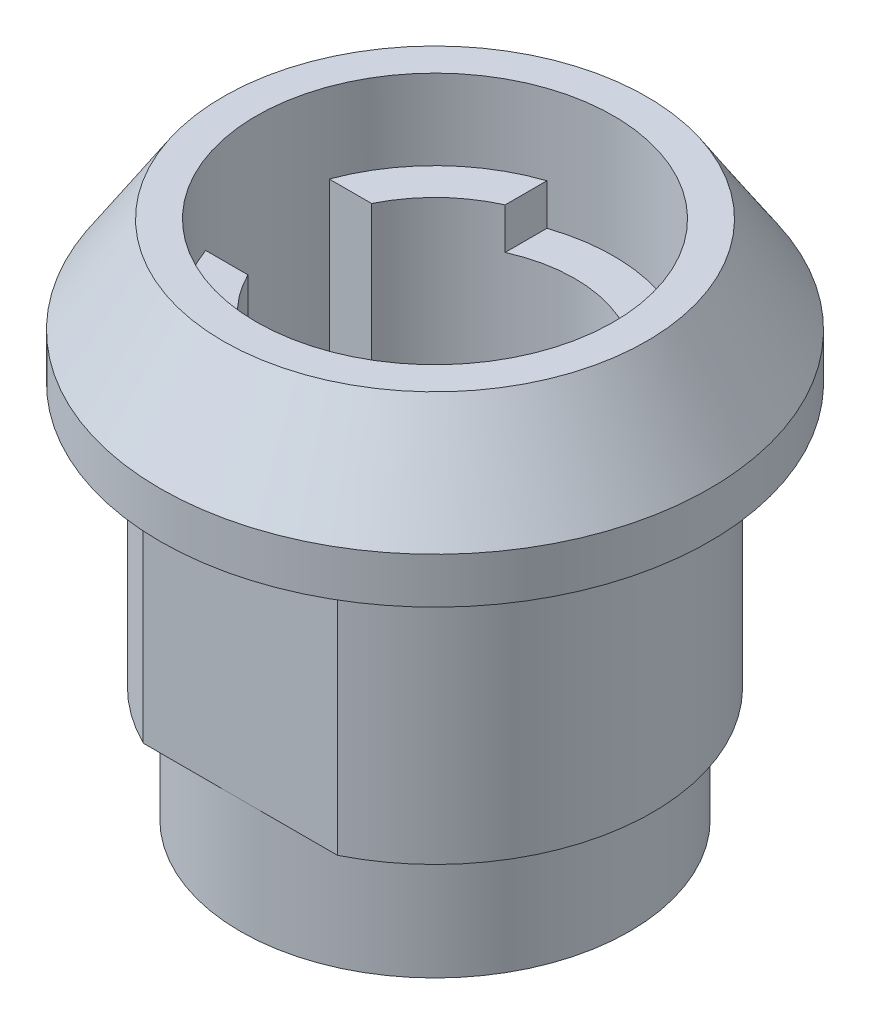
ISO-10303-21;
HEADER;
FILE_DESCRIPTION(('STEP AP214'),'2;1');
FILE_NAME('part.step','',(''),(''),'','','');
FILE_SCHEMA(('AUTOMOTIVE_DESIGN { 1 0 10303 214 1 1 1 1 }'));
ENDSEC;
DATA;
#1=APPLICATION_CONTEXT('core data for automotive mechanical design processes');
#2=APPLICATION_PROTOCOL_DEFINITION('international standard','automotive_design',2000,#1);
#3=PRODUCT_CONTEXT('',#1,'mechanical');
#4=PRODUCT('Part','Part','',(#3));
#5=PRODUCT_RELATED_PRODUCT_CATEGORY('part','',(#4));
#6=PRODUCT_DEFINITION_FORMATION('','',#4);
#7=PRODUCT_DEFINITION_CONTEXT('part definition',#1,'design');
#8=PRODUCT_DEFINITION('design','',#6,#7);
#9=PRODUCT_DEFINITION_SHAPE('','',#8);
#10=(LENGTH_UNIT() NAMED_UNIT(*) SI_UNIT(.MILLI.,.METRE.));
#11=(NAMED_UNIT(*) PLANE_ANGLE_UNIT() SI_UNIT($,.RADIAN.));
#12=(NAMED_UNIT(*) SI_UNIT($,.STERADIAN.) SOLID_ANGLE_UNIT());
#13=UNCERTAINTY_MEASURE_WITH_UNIT(LENGTH_MEASURE(1.E-05),#10,'distance_accuracy_value','');
#14=(GEOMETRIC_REPRESENTATION_CONTEXT(3) GLOBAL_UNCERTAINTY_ASSIGNED_CONTEXT((#13)) GLOBAL_UNIT_ASSIGNED_CONTEXT((#10,
#11,#12)) REPRESENTATION_CONTEXT('',''));
#15=CARTESIAN_POINT('',(0.,0.,0.));
#16=DIRECTION('',(0.,0.,1.));
#17=DIRECTION('',(1.,0.,0.));
#18=AXIS2_PLACEMENT_3D('',#15,#16,#17);
#19=CARTESIAN_POINT('',(0.,8.7,0.));
#20=DIRECTION('',(0.,1.,0.));
#21=DIRECTION('',(0.,0.,-1.));
#22=AXIS2_PLACEMENT_3D('',#19,#20,#21);
#23=CYLINDRICAL_SURFACE('',#22,6.1);
#24=CARTESIAN_POINT('',(0.,17.4,0.));
#25=DIRECTION('',(0.,1.,0.));
#26=DIRECTION('',(0.,0.,-1.));
#27=AXIS2_PLACEMENT_3D('',#24,#25,#26);
#28=CIRCLE('',#27,6.1);
#29=CARTESIAN_POINT('',(-2.5,17.4,5.56417109729742));
#30=VERTEX_POINT('',#29);
#31=CARTESIAN_POINT('',(5.46991773247094,17.4,2.7));
#32=VERTEX_POINT('',#31);
#33=EDGE_CURVE('E11',#30,#32,#28,.T.);
#34=ORIENTED_EDGE('',*,*,#33,.T.);
#35=DIRECTION('',(0.,1.,0.));
#36=VECTOR('',#35,1.);
#37=CARTESIAN_POINT('',(5.46991773247094,3.8,2.7));
#38=LINE('',#37,#36);
#39=CARTESIAN_POINT('',(5.46991773247094,3.8,2.7));
#40=VERTEX_POINT('',#39);
#41=EDGE_CURVE('E42',#40,#32,#38,.T.);
#42=ORIENTED_EDGE('',*,*,#41,.F.);
#43=CARTESIAN_POINT('',(0.,3.8,0.));
#44=DIRECTION('',(0.,-1.,0.));
#45=DIRECTION('',(0.,0.,-1.));
#46=AXIS2_PLACEMENT_3D('',#43,#44,#45);
#47=CIRCLE('',#46,6.1);
#48=CARTESIAN_POINT('',(5.46991773247094,3.8,-2.7));
#49=VERTEX_POINT('',#48);
#50=EDGE_CURVE('E271',#49,#40,#47,.T.);
#51=ORIENTED_EDGE('',*,*,#50,.F.);
#52=DIRECTION('',(0.,1.,0.));
#53=VECTOR('',#52,1.);
#54=CARTESIAN_POINT('',(5.46991773247094,3.8,-2.7));
#55=LINE('',#54,#53);
#56=CARTESIAN_POINT('',(5.46991773247094,17.4,-2.7));
#57=VERTEX_POINT('',#56);
#58=EDGE_CURVE('E28',#49,#57,#55,.T.);
#59=ORIENTED_EDGE('',*,*,#58,.T.);
#60=CARTESIAN_POINT('',(0.,17.4,0.));
#61=DIRECTION('',(0.,1.,0.));
#62=DIRECTION('',(0.,0.,-1.));
#63=AXIS2_PLACEMENT_3D('',#60,#61,#62);
#64=CIRCLE('',#63,6.1);
#65=CARTESIAN_POINT('',(-2.5,17.4,-5.56417109729743));
#66=VERTEX_POINT('',#65);
#67=EDGE_CURVE('E254',#57,#66,#64,.T.);
#68=ORIENTED_EDGE('',*,*,#67,.T.);
#69=DIRECTION('',(0.,1.,0.));
#70=VECTOR('',#69,1.);
#71=CARTESIAN_POINT('',(-2.5,17.4,-5.56417109729743));
#72=LINE('',#71,#70);
#73=CARTESIAN_POINT('',(-2.5,19.2,-5.56417109729743));
#74=VERTEX_POINT('',#73);
#75=EDGE_CURVE('E311',#66,#74,#72,.T.);
#76=ORIENTED_EDGE('',*,*,#75,.T.);
#77=CARTESIAN_POINT('',(0.,19.2,0.));
#78=DIRECTION('',(0.,-1.,0.));
#79=DIRECTION('',(0.,0.,-1.));
#80=AXIS2_PLACEMENT_3D('',#77,#78,#79);
#81=CIRCLE('',#80,6.1);
#82=CARTESIAN_POINT('',(-5.46991773247094,19.2,-2.7));
#83=VERTEX_POINT('',#82);
#84=EDGE_CURVE('E256',#83,#74,#81,.T.);
#85=ORIENTED_EDGE('',*,*,#84,.F.);
#86=DIRECTION('',(0.,1.,0.));
#87=VECTOR('',#86,1.);
#88=CARTESIAN_POINT('',(-5.46991773247094,3.8,-2.7));
#89=LINE('',#88,#87);
#90=CARTESIAN_POINT('',(-5.46991773247094,3.8,-2.7));
#91=VERTEX_POINT('',#90);
#92=EDGE_CURVE('E349',#91,#83,#89,.T.);
#93=ORIENTED_EDGE('',*,*,#92,.F.);
#94=CARTESIAN_POINT('',(0.,3.8,0.));
#95=DIRECTION('',(0.,-1.,0.));
#96=DIRECTION('',(0.,0.,-1.));
#97=AXIS2_PLACEMENT_3D('',#94,#95,#96);
#98=CIRCLE('',#97,6.1);
#99=CARTESIAN_POINT('',(-5.46991773247094,3.8,2.7));
#100=VERTEX_POINT('',#99);
#101=EDGE_CURVE('E267',#100,#91,#98,.T.);
#102=ORIENTED_EDGE('',*,*,#101,.F.);
#103=DIRECTION('',(0.,1.,0.));
#104=VECTOR('',#103,1.);
#105=CARTESIAN_POINT('',(-5.46991773247094,3.8,2.7));
#106=LINE('',#105,#104);
#107=CARTESIAN_POINT('',(-5.46991773247094,19.2,2.7));
#108=VERTEX_POINT('',#107);
#109=EDGE_CURVE('E307',#100,#108,#106,.T.);
#110=ORIENTED_EDGE('',*,*,#109,.T.);
#111=CARTESIAN_POINT('',(0.,19.2,0.));
#112=DIRECTION('',(0.,1.,0.));
#113=DIRECTION('',(0.,0.,-1.));
#114=AXIS2_PLACEMENT_3D('',#111,#112,#113);
#115=CIRCLE('',#114,6.1);
#116=CARTESIAN_POINT('',(-2.5,19.2,5.56417109729743));
#117=VERTEX_POINT('',#116);
#118=EDGE_CURVE('E299',#108,#117,#115,.T.);
#119=ORIENTED_EDGE('',*,*,#118,.T.);
#120=DIRECTION('',(0.,1.,0.));
#121=VECTOR('',#120,1.);
#122=CARTESIAN_POINT('',(-2.5,17.4,5.56417109729743));
#123=LINE('',#122,#121);
#124=EDGE_CURVE('E316',#30,#117,#123,.T.);
#125=ORIENTED_EDGE('',*,*,#124,.F.);
#126=EDGE_LOOP('',(#34,#42,#51,#59,#68,#76,#85,#93,#102,#110,#119,#125));
#127=FACE_BOUND('',#126,.T.);
#128=CARTESIAN_POINT('',(0.,0.,0.));
#129=DIRECTION('',(0.,-1.,0.));
#130=DIRECTION('',(0.,0.,-1.));
#131=AXIS2_PLACEMENT_3D('',#128,#129,#130);
#132=CIRCLE('',#131,6.1);
#133=CARTESIAN_POINT('',(0.,0.,6.1));
#134=VERTEX_POINT('',#133);
#135=EDGE_CURVE('E295',#134,#134,#132,.T.);
#136=ORIENTED_EDGE('',*,*,#135,.T.);
#137=EDGE_LOOP('',(#136));
#138=FACE_BOUND('',#137,.T.);
#139=ADVANCED_FACE('F17',(#127,#138),#23,.F.);
#140=CARTESIAN_POINT('',(0.,13.25,0.));
#141=DIRECTION('',(0.,1.,0.));
#142=DIRECTION('',(0.,0.,-1.));
#143=AXIS2_PLACEMENT_3D('',#140,#141,#142);
#144=CYLINDRICAL_SURFACE('',#143,7.8);
#145=CARTESIAN_POINT('',(0.,22.7,0.));
#146=DIRECTION('',(0.,-1.,0.));
#147=DIRECTION('',(0.,0.,-1.));
#148=AXIS2_PLACEMENT_3D('',#145,#146,#147);
#149=CIRCLE('',#148,7.8);
#150=CARTESIAN_POINT('',(0.,22.7,7.8));
#151=VERTEX_POINT('',#150);
#152=EDGE_CURVE('E250',#151,#151,#149,.T.);
#153=ORIENTED_EDGE('',*,*,#152,.F.);
#154=EDGE_LOOP('',(#153));
#155=FACE_BOUND('',#154,.T.);
#156=CARTESIAN_POINT('',(0.,17.4,0.));
#157=DIRECTION('',(0.,-1.,0.));
#158=DIRECTION('',(0.,0.,1.));
#159=AXIS2_PLACEMENT_3D('',#156,#157,#158);
#160=CIRCLE('',#159,7.8);
#161=CARTESIAN_POINT('',(7.31778655059028,17.4,2.7));
#162=VERTEX_POINT('',#161);
#163=CARTESIAN_POINT('',(-2.5,17.4,7.38850458482636));
#164=VERTEX_POINT('',#163);
#165=EDGE_CURVE('E300',#162,#164,#160,.T.);
#166=ORIENTED_EDGE('',*,*,#165,.T.);
#167=DIRECTION('',(0.,1.,0.));
#168=VECTOR('',#167,1.);
#169=CARTESIAN_POINT('',(-2.5,17.4,7.38850458482636));
#170=LINE('',#169,#168);
#171=CARTESIAN_POINT('',(-2.5,19.2,7.38850458482636));
#172=VERTEX_POINT('',#171);
#173=EDGE_CURVE('E279',#164,#172,#170,.T.);
#174=ORIENTED_EDGE('',*,*,#173,.T.);
#175=CARTESIAN_POINT('',(0.,19.2,0.));
#176=DIRECTION('',(0.,-1.,0.));
#177=DIRECTION('',(0.,0.,1.));
#178=AXIS2_PLACEMENT_3D('',#175,#176,#177);
#179=CIRCLE('',#178,7.8);
#180=CARTESIAN_POINT('',(-7.31778655059028,19.2,2.7));
#181=VERTEX_POINT('',#180);
#182=EDGE_CURVE('E265',#172,#181,#179,.T.);
#183=ORIENTED_EDGE('',*,*,#182,.T.);
#184=DIRECTION('',(0.,1.,0.));
#185=VECTOR('',#184,1.);
#186=CARTESIAN_POINT('',(-7.31778655059028,3.8,2.7));
#187=LINE('',#186,#185);
#188=CARTESIAN_POINT('',(-7.31778655059028,3.8,2.7));
#189=VERTEX_POINT('',#188);
#190=EDGE_CURVE('E71',#189,#181,#187,.T.);
#191=ORIENTED_EDGE('',*,*,#190,.F.);
#192=CARTESIAN_POINT('',(0.,3.8,0.));
#193=DIRECTION('',(0.,1.,0.));
#194=DIRECTION('',(0.,0.,1.));
#195=AXIS2_PLACEMENT_3D('',#192,#193,#194);
#196=CIRCLE('',#195,7.8);
#197=CARTESIAN_POINT('',(-7.31778655059028,3.8,-2.7));
#198=VERTEX_POINT('',#197);
#199=EDGE_CURVE('E83',#198,#189,#196,.T.);
#200=ORIENTED_EDGE('',*,*,#199,.F.);
#201=DIRECTION('',(0.,1.,0.));
#202=VECTOR('',#201,1.);
#203=CARTESIAN_POINT('',(-7.31778655059028,3.8,-2.7));
#204=LINE('',#203,#202);
#205=CARTESIAN_POINT('',(-7.31778655059028,19.2,-2.7));
#206=VERTEX_POINT('',#205);
#207=EDGE_CURVE('E262',#198,#206,#204,.T.);
#208=ORIENTED_EDGE('',*,*,#207,.T.);
#209=CARTESIAN_POINT('',(0.,19.2,0.));
#210=DIRECTION('',(0.,1.,0.));
#211=DIRECTION('',(0.,0.,1.));
#212=AXIS2_PLACEMENT_3D('',#209,#210,#211);
#213=CIRCLE('',#212,7.8);
#214=CARTESIAN_POINT('',(-2.5,19.2,-7.38850458482635));
#215=VERTEX_POINT('',#214);
#216=EDGE_CURVE('E304',#215,#206,#213,.T.);
#217=ORIENTED_EDGE('',*,*,#216,.F.);
#218=DIRECTION('',(0.,1.,0.));
#219=VECTOR('',#218,1.);
#220=CARTESIAN_POINT('',(-2.5,17.4,-7.38850458482635));
#221=LINE('',#220,#219);
#222=CARTESIAN_POINT('',(-2.5,17.4,-7.38850458482635));
#223=VERTEX_POINT('',#222);
#224=EDGE_CURVE('E289',#223,#215,#221,.T.);
#225=ORIENTED_EDGE('',*,*,#224,.F.);
#226=CARTESIAN_POINT('',(0.,17.4,0.));
#227=DIRECTION('',(0.,-1.,0.));
#228=DIRECTION('',(0.,0.,1.));
#229=AXIS2_PLACEMENT_3D('',#226,#227,#228);
#230=CIRCLE('',#229,7.8);
#231=CARTESIAN_POINT('',(7.31778655059028,17.4,-2.7));
#232=VERTEX_POINT('',#231);
#233=EDGE_CURVE('E266',#223,#232,#230,.T.);
#234=ORIENTED_EDGE('',*,*,#233,.T.);
#235=DIRECTION('',(0.,1.,0.));
#236=VECTOR('',#235,1.);
#237=CARTESIAN_POINT('',(7.31778655059028,3.8,-2.7));
#238=LINE('',#237,#236);
#239=CARTESIAN_POINT('',(7.31778655059028,3.8,-2.7));
#240=VERTEX_POINT('',#239);
#241=EDGE_CURVE('E321',#240,#232,#238,.T.);
#242=ORIENTED_EDGE('',*,*,#241,.F.);
#243=CARTESIAN_POINT('',(0.,3.8,0.));
#244=DIRECTION('',(0.,1.,0.));
#245=DIRECTION('',(0.,0.,1.));
#246=AXIS2_PLACEMENT_3D('',#243,#244,#245);
#247=CIRCLE('',#246,7.8);
#248=CARTESIAN_POINT('',(7.31778655059028,3.8,2.7));
#249=VERTEX_POINT('',#248);
#250=EDGE_CURVE('E261',#249,#240,#247,.T.);
#251=ORIENTED_EDGE('',*,*,#250,.F.);
#252=DIRECTION('',(0.,1.,0.));
#253=VECTOR('',#252,1.);
#254=CARTESIAN_POINT('',(7.31778655059028,3.8,2.7));
#255=LINE('',#254,#253);
#256=EDGE_CURVE('E322',#249,#162,#255,.T.);
#257=ORIENTED_EDGE('',*,*,#256,.T.);
#258=EDGE_LOOP('',(#166,#174,#183,#191,#200,#208,#217,#225,#234,#242,#251,#257));
#259=FACE_BOUND('',#258,.T.);
#260=ADVANCED_FACE('F459',(#155,#259),#144,.F.);
#261=CARTESIAN_POINT('',(0.,22.7,0.));
#262=DIRECTION('',(0.,-1.,0.));
#263=DIRECTION('',(0.,0.,-1.));
#264=AXIS2_PLACEMENT_3D('',#261,#262,#263);
#265=CONICAL_SURFACE('',#264,9.25,0.579715500445564);
#266=CARTESIAN_POINT('',(0.,22.7,0.));
#267=DIRECTION('',(0.,-1.,0.));
#268=DIRECTION('',(0.,0.,-1.));
#269=AXIS2_PLACEMENT_3D('',#266,#267,#268);
#270=CIRCLE('',#269,9.25);
#271=CARTESIAN_POINT('',(0.,22.7,9.25));
#272=VERTEX_POINT('',#271);
#273=EDGE_CURVE('E283',#272,#272,#270,.T.);
#274=ORIENTED_EDGE('',*,*,#273,.T.);
#275=EDGE_LOOP('',(#274));
#276=FACE_BOUND('',#275,.T.);
#277=CARTESIAN_POINT('',(0.,18.5,0.));
#278=DIRECTION('',(0.,-1.,0.));
#279=DIRECTION('',(0.,0.,-1.));
#280=AXIS2_PLACEMENT_3D('',#277,#278,#279);
#281=CIRCLE('',#280,12.);
#282=CARTESIAN_POINT('',(0.,18.5,12.));
#283=VERTEX_POINT('',#282);
#284=EDGE_CURVE('E235',#283,#283,#281,.T.);
#285=ORIENTED_EDGE('',*,*,#284,.F.);
#286=EDGE_LOOP('',(#285));
#287=FACE_BOUND('',#286,.T.);
#288=ADVANCED_FACE('F643',(#276,#287),#265,.T.);
#289=CARTESIAN_POINT('',(0.,0.,0.));
#290=DIRECTION('',(0.,1.,0.));
#291=DIRECTION('',(0.,0.,-1.));
#292=AXIS2_PLACEMENT_3D('',#289,#290,#291);
#293=CYLINDRICAL_SURFACE('',#292,12.);
#294=CARTESIAN_POINT('',(0.,16.5,0.));
#295=DIRECTION('',(0.,-1.,0.));
#296=DIRECTION('',(0.,0.,-1.));
#297=AXIS2_PLACEMENT_3D('',#294,#295,#296);
#298=CIRCLE('',#297,12.);
#299=CARTESIAN_POINT('',(0.,16.5,12.));
#300=VERTEX_POINT('',#299);
#301=EDGE_CURVE('E189',#300,#300,#298,.T.);
#302=ORIENTED_EDGE('',*,*,#301,.F.);
#303=EDGE_LOOP('',(#302));
#304=FACE_BOUND('',#303,.T.);
#305=ORIENTED_EDGE('',*,*,#284,.T.);
#306=EDGE_LOOP('',(#305));
#307=FACE_BOUND('',#306,.T.);
#308=ADVANCED_FACE('F638',(#304,#307),#293,.T.);
#309=CARTESIAN_POINT('',(0.,0.,0.));
#310=DIRECTION('',(0.,1.,0.));
#311=DIRECTION('',(0.,0.,-1.));
#312=AXIS2_PLACEMENT_3D('',#309,#310,#311);
#313=CYLINDRICAL_SURFACE('',#312,8.5);
#314=CARTESIAN_POINT('',(0.,0.,0.));
#315=DIRECTION('',(0.,-1.,0.));
#316=DIRECTION('',(0.,0.,-1.));
#317=AXIS2_PLACEMENT_3D('',#314,#315,#316);
#318=CIRCLE('',#317,8.5);
#319=CARTESIAN_POINT('',(0.,0.,8.5));
#320=VERTEX_POINT('',#319);
#321=EDGE_CURVE('E194',#320,#320,#318,.T.);
#322=ORIENTED_EDGE('',*,*,#321,.F.);
#323=EDGE_LOOP('',(#322));
#324=FACE_BOUND('',#323,.T.);
#325=CARTESIAN_POINT('',(0.,5.,0.));
#326=DIRECTION('',(0.,-1.,0.));
#327=DIRECTION('',(0.,0.,-1.));
#328=AXIS2_PLACEMENT_3D('',#325,#326,#327);
#329=CIRCLE('',#328,8.5);
#330=CARTESIAN_POINT('',(0.,5.,8.5));
#331=VERTEX_POINT('',#330);
#332=CARTESIAN_POINT('',(0.,5.,-8.5));
#333=VERTEX_POINT('',#332);
#334=EDGE_CURVE('E227',#331,#333,#329,.T.);
#335=ORIENTED_EDGE('',*,*,#334,.T.);
#336=CARTESIAN_POINT('',(0.,5.,0.));
#337=DIRECTION('',(0.,-1.,0.));
#338=DIRECTION('',(0.,0.,-1.));
#339=AXIS2_PLACEMENT_3D('',#336,#337,#338);
#340=CIRCLE('',#339,8.5);
#341=EDGE_CURVE('E220',#333,#331,#340,.T.);
#342=ORIENTED_EDGE('',*,*,#341,.T.);
#343=EDGE_LOOP('',(#335,#342));
#344=FACE_BOUND('',#343,.T.);
#345=ADVANCED_FACE('F230',(#324,#344),#313,.T.);
#346=CARTESIAN_POINT('',(0.,5.,0.));
#347=DIRECTION('',(0.,1.,0.));
#348=DIRECTION('',(-1.,0.,0.));
#349=AXIS2_PLACEMENT_3D('',#346,#347,#348);
#350=CYLINDRICAL_SURFACE('',#349,9.5);
#351=DIRECTION('',(0.,1.,0.));
#352=VECTOR('',#351,1.);
#353=CARTESIAN_POINT('',(-4.24264068711929,5.,-8.5));
#354=LINE('',#353,#352);
#355=CARTESIAN_POINT('',(-4.24264068711929,5.,-8.5));
#356=VERTEX_POINT('',#355);
#357=CARTESIAN_POINT('',(-4.24264068711929,16.5,-8.5));
#358=VERTEX_POINT('',#357);
#359=EDGE_CURVE('E361',#356,#358,#354,.T.);
#360=ORIENTED_EDGE('',*,*,#359,.F.);
#361=CARTESIAN_POINT('',(0.,5.,0.));
#362=DIRECTION('',(0.,-1.,0.));
#363=DIRECTION('',(-1.,0.,0.));
#364=AXIS2_PLACEMENT_3D('',#361,#362,#363);
#365=CIRCLE('',#364,9.5);
#366=CARTESIAN_POINT('',(-4.24264068711929,5.,8.5));
#367=VERTEX_POINT('',#366);
#368=EDGE_CURVE('E239',#367,#356,#365,.T.);
#369=ORIENTED_EDGE('',*,*,#368,.F.);
#370=DIRECTION('',(0.,-1.,0.));
#371=VECTOR('',#370,1.);
#372=CARTESIAN_POINT('',(-4.24264068711929,16.5,8.5));
#373=LINE('',#372,#371);
#374=CARTESIAN_POINT('',(-4.24264068711929,16.5,8.5));
#375=VERTEX_POINT('',#374);
#376=EDGE_CURVE('E248',#375,#367,#373,.T.);
#377=ORIENTED_EDGE('',*,*,#376,.F.);
#378=CARTESIAN_POINT('',(0.,16.5,0.));
#379=DIRECTION('',(0.,1.,0.));
#380=DIRECTION('',(-1.,0.,0.));
#381=AXIS2_PLACEMENT_3D('',#378,#379,#380);
#382=CIRCLE('',#381,9.5);
#383=EDGE_CURVE('E288',#358,#375,#382,.T.);
#384=ORIENTED_EDGE('',*,*,#383,.F.);
#385=EDGE_LOOP('',(#360,#369,#377,#384));
#386=FACE_BOUND('',#385,.T.);
#387=ADVANCED_FACE('F431',(#386),#350,.T.);
#388=CARTESIAN_POINT('',(0.,5.,0.));
#389=DIRECTION('',(0.,1.,0.));
#390=DIRECTION('',(1.,0.,0.));
#391=AXIS2_PLACEMENT_3D('',#388,#389,#390);
#392=CYLINDRICAL_SURFACE('',#391,9.5);
#393=DIRECTION('',(0.,-1.,0.));
#394=VECTOR('',#393,1.);
#395=CARTESIAN_POINT('',(4.24264068711929,16.5,-8.5));
#396=LINE('',#395,#394);
#397=CARTESIAN_POINT('',(4.24264068711929,16.5,-8.5));
#398=VERTEX_POINT('',#397);
#399=CARTESIAN_POINT('',(4.24264068711929,5.,-8.5));
#400=VERTEX_POINT('',#399);
#401=EDGE_CURVE('E211',#398,#400,#396,.T.);
#402=ORIENTED_EDGE('',*,*,#401,.F.);
#403=CARTESIAN_POINT('',(0.,16.5,0.));
#404=DIRECTION('',(0.,1.,0.));
#405=DIRECTION('',(-1.,0.,0.));
#406=AXIS2_PLACEMENT_3D('',#403,#404,#405);
#407=CIRCLE('',#406,9.5);
#408=CARTESIAN_POINT('',(4.24264068711929,16.5,8.5));
#409=VERTEX_POINT('',#408);
#410=EDGE_CURVE('E293',#409,#398,#407,.T.);
#411=ORIENTED_EDGE('',*,*,#410,.F.);
#412=DIRECTION('',(0.,1.,0.));
#413=VECTOR('',#412,1.);
#414=CARTESIAN_POINT('',(4.24264068711929,5.,8.5));
#415=LINE('',#414,#413);
#416=CARTESIAN_POINT('',(4.24264068711929,5.,8.5));
#417=VERTEX_POINT('',#416);
#418=EDGE_CURVE('E217',#417,#409,#415,.T.);
#419=ORIENTED_EDGE('',*,*,#418,.F.);
#420=CARTESIAN_POINT('',(0.,5.,0.));
#421=DIRECTION('',(0.,-1.,0.));
#422=DIRECTION('',(-1.,0.,0.));
#423=AXIS2_PLACEMENT_3D('',#420,#421,#422);
#424=CIRCLE('',#423,9.5);
#425=EDGE_CURVE('E228',#400,#417,#424,.T.);
#426=ORIENTED_EDGE('',*,*,#425,.F.);
#427=EDGE_LOOP('',(#402,#411,#419,#426));
#428=FACE_BOUND('',#427,.T.);
#429=ADVANCED_FACE('F438',(#428),#392,.T.);
#430=CARTESIAN_POINT('',(-10.,5.,0.));
#431=DIRECTION('',(0.,-1.,0.));
#432=DIRECTION('',(0.,0.,-1.));
#433=AXIS2_PLACEMENT_3D('',#430,#431,#432);
#434=PLANE('',#433);
#435=ORIENTED_EDGE('',*,*,#425,.T.);
#436=DIRECTION('',(-1.,0.,0.));
#437=VECTOR('',#436,1.);
#438=CARTESIAN_POINT('',(4.24264068711928,5.,8.5));
#439=LINE('',#438,#437);
#440=EDGE_CURVE('E216',#417,#331,#439,.T.);
#441=ORIENTED_EDGE('',*,*,#440,.T.);
#442=ORIENTED_EDGE('',*,*,#341,.F.);
#443=DIRECTION('',(1.,0.,0.));
#444=VECTOR('',#443,1.);
#445=CARTESIAN_POINT('',(0.,5.,-8.5));
#446=LINE('',#445,#444);
#447=EDGE_CURVE('E202',#333,#400,#446,.T.);
#448=ORIENTED_EDGE('',*,*,#447,.T.);
#449=EDGE_LOOP('',(#435,#441,#442,#448));
#450=FACE_BOUND('',#449,.T.);
#451=ADVANCED_FACE('F222',(#450),#434,.T.);
#452=CARTESIAN_POINT('',(-11.,16.5,8.5));
#453=DIRECTION('',(0.,0.,1.));
#454=DIRECTION('',(1.,0.,0.));
#455=AXIS2_PLACEMENT_3D('',#452,#453,#454);
#456=PLANE('',#455);
#457=ORIENTED_EDGE('',*,*,#418,.T.);
#458=DIRECTION('',(1.,0.,0.));
#459=VECTOR('',#458,1.);
#460=CARTESIAN_POINT('',(-4.24264068711928,16.5,8.5));
#461=LINE('',#460,#459);
#462=EDGE_CURVE('E337',#375,#409,#461,.T.);
#463=ORIENTED_EDGE('',*,*,#462,.F.);
#464=ORIENTED_EDGE('',*,*,#376,.T.);
#465=DIRECTION('',(-1.,0.,0.));
#466=VECTOR('',#465,1.);
#467=CARTESIAN_POINT('',(0.,5.,8.5));
#468=LINE('',#467,#466);
#469=EDGE_CURVE('E241',#331,#367,#468,.T.);
#470=ORIENTED_EDGE('',*,*,#469,.F.);
#471=ORIENTED_EDGE('',*,*,#440,.F.);
#472=EDGE_LOOP('',(#457,#463,#464,#470,#471));
#473=FACE_BOUND('',#472,.T.);
#474=ADVANCED_FACE('F428',(#473),#456,.T.);
#475=CARTESIAN_POINT('',(-10.,5.,0.));
#476=DIRECTION('',(0.,-1.,0.));
#477=DIRECTION('',(0.,0.,-1.));
#478=AXIS2_PLACEMENT_3D('',#475,#476,#477);
#479=PLANE('',#478);
#480=ORIENTED_EDGE('',*,*,#368,.T.);
#481=DIRECTION('',(1.,0.,0.));
#482=VECTOR('',#481,1.);
#483=CARTESIAN_POINT('',(-4.24264068711928,5.,-8.5));
#484=LINE('',#483,#482);
#485=EDGE_CURVE('E207',#356,#333,#484,.T.);
#486=ORIENTED_EDGE('',*,*,#485,.T.);
#487=ORIENTED_EDGE('',*,*,#334,.F.);
#488=ORIENTED_EDGE('',*,*,#469,.T.);
#489=EDGE_LOOP('',(#480,#486,#487,#488));
#490=FACE_BOUND('',#489,.T.);
#491=ADVANCED_FACE('F238',(#490),#479,.T.);
#492=CARTESIAN_POINT('',(-7.5,22.7,0.));
#493=DIRECTION('',(0.,1.,0.));
#494=DIRECTION('',(1.,0.,0.));
#495=AXIS2_PLACEMENT_3D('',#492,#493,#494);
#496=PLANE('',#495);
#497=ORIENTED_EDGE('',*,*,#273,.F.);
#498=EDGE_LOOP('',(#497));
#499=FACE_BOUND('',#498,.T.);
#500=ORIENTED_EDGE('',*,*,#152,.T.);
#501=EDGE_LOOP('',(#500));
#502=FACE_BOUND('',#501,.T.);
#503=ADVANCED_FACE('F655',(#499,#502),#496,.T.);
#504=CARTESIAN_POINT('',(0.,17.4,0.));
#505=DIRECTION('',(0.,1.,0.));
#506=DIRECTION('',(1.,0.,0.));
#507=AXIS2_PLACEMENT_3D('',#504,#505,#506);
#508=PLANE('',#507);
#509=ORIENTED_EDGE('',*,*,#233,.F.);
#510=DIRECTION('',(0.,0.,1.));
#511=VECTOR('',#510,1.);
#512=CARTESIAN_POINT('',(-2.5,17.4,-7.38850458482635));
#513=LINE('',#512,#511);
#514=EDGE_CURVE('E331',#223,#66,#513,.T.);
#515=ORIENTED_EDGE('',*,*,#514,.T.);
#516=ORIENTED_EDGE('',*,*,#67,.F.);
#517=DIRECTION('',(-1.,0.,0.));
#518=VECTOR('',#517,1.);
#519=CARTESIAN_POINT('',(7.31778655059028,17.4,-2.7));
#520=LINE('',#519,#518);
#521=EDGE_CURVE('E382',#232,#57,#520,.T.);
#522=ORIENTED_EDGE('',*,*,#521,.F.);
#523=EDGE_LOOP('',(#509,#515,#516,#522));
#524=FACE_BOUND('',#523,.T.);
#525=ADVANCED_FACE('F461',(#524),#508,.T.);
#526=CARTESIAN_POINT('',(-8.5,0.,0.));
#527=DIRECTION('',(0.,-1.,0.));
#528=DIRECTION('',(0.,0.,-1.));
#529=AXIS2_PLACEMENT_3D('',#526,#527,#528);
#530=PLANE('',#529);
#531=ORIENTED_EDGE('',*,*,#321,.T.);
#532=EDGE_LOOP('',(#531));
#533=FACE_BOUND('',#532,.T.);
#534=ORIENTED_EDGE('',*,*,#135,.F.);
#535=EDGE_LOOP('',(#534));
#536=FACE_BOUND('',#535,.T.);
#537=ADVANCED_FACE('F654',(#533,#536),#530,.T.);
#538=CARTESIAN_POINT('',(11.,16.5,-8.5));
#539=DIRECTION('',(0.,0.,-1.));
#540=DIRECTION('',(0.,-1.,0.));
#541=AXIS2_PLACEMENT_3D('',#538,#539,#540);
#542=PLANE('',#541);
#543=ORIENTED_EDGE('',*,*,#401,.T.);
#544=ORIENTED_EDGE('',*,*,#447,.F.);
#545=ORIENTED_EDGE('',*,*,#485,.F.);
#546=ORIENTED_EDGE('',*,*,#359,.T.);
#547=DIRECTION('',(-1.,0.,0.));
#548=VECTOR('',#547,1.);
#549=CARTESIAN_POINT('',(4.24264068711928,16.5,-8.5));
#550=LINE('',#549,#548);
#551=EDGE_CURVE('E284',#398,#358,#550,.T.);
#552=ORIENTED_EDGE('',*,*,#551,.F.);
#553=EDGE_LOOP('',(#543,#544,#545,#546,#552));
#554=FACE_BOUND('',#553,.T.);
#555=ADVANCED_FACE('F204',(#554),#542,.T.);
#556=CARTESIAN_POINT('',(-12.,16.5,0.));
#557=DIRECTION('',(0.,-1.,0.));
#558=DIRECTION('',(0.,0.,-1.));
#559=AXIS2_PLACEMENT_3D('',#556,#557,#558);
#560=PLANE('',#559);
#561=ORIENTED_EDGE('',*,*,#301,.T.);
#562=EDGE_LOOP('',(#561));
#563=FACE_BOUND('',#562,.T.);
#564=ORIENTED_EDGE('',*,*,#551,.T.);
#565=ORIENTED_EDGE('',*,*,#383,.T.);
#566=ORIENTED_EDGE('',*,*,#462,.T.);
#567=ORIENTED_EDGE('',*,*,#410,.T.);
#568=EDGE_LOOP('',(#564,#565,#566,#567));
#569=FACE_BOUND('',#568,.T.);
#570=ADVANCED_FACE('F435',(#563,#569),#560,.T.);
#571=CARTESIAN_POINT('',(-2.5,-62.4649251514995,-5.56417109729743));
#572=DIRECTION('',(1.,0.,0.));
#573=DIRECTION('',(0.,1.,0.));
#574=AXIS2_PLACEMENT_3D('',#571,#572,#573);
#575=PLANE('',#574);
#576=ORIENTED_EDGE('',*,*,#514,.F.);
#577=ORIENTED_EDGE('',*,*,#224,.T.);
#578=DIRECTION('',(0.,0.,-1.));
#579=VECTOR('',#578,1.);
#580=CARTESIAN_POINT('',(-2.5,19.2,-5.56417109729743));
#581=LINE('',#580,#579);
#582=EDGE_CURVE('E294',#74,#215,#581,.T.);
#583=ORIENTED_EDGE('',*,*,#582,.F.);
#584=ORIENTED_EDGE('',*,*,#75,.F.);
#585=EDGE_LOOP('',(#576,#577,#583,#584));
#586=FACE_BOUND('',#585,.T.);
#587=ADVANCED_FACE('F457',(#586),#575,.T.);
#588=CARTESIAN_POINT('',(0.,19.2,0.));
#589=DIRECTION('',(0.,1.,0.));
#590=DIRECTION('',(1.,0.,0.));
#591=AXIS2_PLACEMENT_3D('',#588,#589,#590);
#592=PLANE('',#591);
#593=ORIENTED_EDGE('',*,*,#582,.T.);
#594=ORIENTED_EDGE('',*,*,#216,.T.);
#595=DIRECTION('',(1.,0.,0.));
#596=VECTOR('',#595,1.);
#597=CARTESIAN_POINT('',(-7.31778655059028,19.2,-2.7));
#598=LINE('',#597,#596);
#599=EDGE_CURVE('E260',#206,#83,#598,.T.);
#600=ORIENTED_EDGE('',*,*,#599,.T.);
#601=ORIENTED_EDGE('',*,*,#84,.T.);
#602=EDGE_LOOP('',(#593,#594,#600,#601));
#603=FACE_BOUND('',#602,.T.);
#604=ADVANCED_FACE('F449',(#603),#592,.T.);
#605=CARTESIAN_POINT('',(0.,3.8,0.));
#606=DIRECTION('',(0.,1.,0.));
#607=DIRECTION('',(1.,0.,0.));
#608=AXIS2_PLACEMENT_3D('',#605,#606,#607);
#609=PLANE('',#608);
#610=DIRECTION('',(-1.,0.,0.));
#611=VECTOR('',#610,1.);
#612=CARTESIAN_POINT('',(7.31778655059028,3.8,2.7));
#613=LINE('',#612,#611);
#614=EDGE_CURVE('E21',#249,#40,#613,.T.);
#615=ORIENTED_EDGE('',*,*,#614,.F.);
#616=ORIENTED_EDGE('',*,*,#250,.T.);
#617=DIRECTION('',(1.,0.,0.));
#618=VECTOR('',#617,1.);
#619=CARTESIAN_POINT('',(5.46991773247094,3.8,-2.7));
#620=LINE('',#619,#618);
#621=EDGE_CURVE('E317',#49,#240,#620,.T.);
#622=ORIENTED_EDGE('',*,*,#621,.F.);
#623=ORIENTED_EDGE('',*,*,#50,.T.);
#624=EDGE_LOOP('',(#615,#616,#622,#623));
#625=FACE_BOUND('',#624,.T.);
#626=ADVANCED_FACE('F467',(#625),#609,.T.);
#627=CARTESIAN_POINT('',(0.,3.8,0.));
#628=DIRECTION('',(0.,1.,0.));
#629=DIRECTION('',(1.,0.,0.));
#630=AXIS2_PLACEMENT_3D('',#627,#628,#629);
#631=PLANE('',#630);
#632=DIRECTION('',(-1.,0.,0.));
#633=VECTOR('',#632,1.);
#634=CARTESIAN_POINT('',(-5.46991773247094,3.8,2.7));
#635=LINE('',#634,#633);
#636=EDGE_CURVE('E345',#100,#189,#635,.T.);
#637=ORIENTED_EDGE('',*,*,#636,.F.);
#638=ORIENTED_EDGE('',*,*,#101,.T.);
#639=DIRECTION('',(1.,0.,0.));
#640=VECTOR('',#639,1.);
#641=CARTESIAN_POINT('',(-7.31778655059028,3.8,-2.7));
#642=LINE('',#641,#640);
#643=EDGE_CURVE('E385',#198,#91,#642,.T.);
#644=ORIENTED_EDGE('',*,*,#643,.F.);
#645=ORIENTED_EDGE('',*,*,#199,.T.);
#646=EDGE_LOOP('',(#637,#638,#644,#645));
#647=FACE_BOUND('',#646,.T.);
#648=ADVANCED_FACE('F692',(#647),#631,.T.);
#649=CARTESIAN_POINT('',(7.31778655059028,-64.2649251514995,-2.7));
#650=DIRECTION('',(0.,0.,1.));
#651=DIRECTION('',(1.,0.,0.));
#652=AXIS2_PLACEMENT_3D('',#649,#650,#651);
#653=PLANE('',#652);
#654=ORIENTED_EDGE('',*,*,#58,.F.);
#655=ORIENTED_EDGE('',*,*,#621,.T.);
#656=ORIENTED_EDGE('',*,*,#241,.T.);
#657=ORIENTED_EDGE('',*,*,#521,.T.);
#658=EDGE_LOOP('',(#654,#655,#656,#657));
#659=FACE_BOUND('',#658,.T.);
#660=ADVANCED_FACE('F19',(#659),#653,.T.);
#661=CARTESIAN_POINT('',(-5.46991773247094,-64.2649251514995,-2.7));
#662=DIRECTION('',(0.,0.,1.));
#663=DIRECTION('',(1.,0.,0.));
#664=AXIS2_PLACEMENT_3D('',#661,#662,#663);
#665=PLANE('',#664);
#666=ORIENTED_EDGE('',*,*,#207,.F.);
#667=ORIENTED_EDGE('',*,*,#643,.T.);
#668=ORIENTED_EDGE('',*,*,#92,.T.);
#669=ORIENTED_EDGE('',*,*,#599,.F.);
#670=EDGE_LOOP('',(#666,#667,#668,#669));
#671=FACE_BOUND('',#670,.T.);
#672=ADVANCED_FACE('F737',(#671),#665,.T.);
#673=CARTESIAN_POINT('',(-7.31778655059028,-64.2649251514995,2.7));
#674=DIRECTION('',(0.,0.,-1.));
#675=DIRECTION('',(0.,-1.,0.));
#676=AXIS2_PLACEMENT_3D('',#673,#674,#675);
#677=PLANE('',#676);
#678=ORIENTED_EDGE('',*,*,#109,.F.);
#679=ORIENTED_EDGE('',*,*,#636,.T.);
#680=ORIENTED_EDGE('',*,*,#190,.T.);
#681=DIRECTION('',(1.,0.,0.));
#682=VECTOR('',#681,1.);
#683=CARTESIAN_POINT('',(-7.31778655059028,19.2,2.7));
#684=LINE('',#683,#682);
#685=EDGE_CURVE('E338',#181,#108,#684,.T.);
#686=ORIENTED_EDGE('',*,*,#685,.T.);
#687=EDGE_LOOP('',(#678,#679,#680,#686));
#688=FACE_BOUND('',#687,.T.);
#689=ADVANCED_FACE('F631',(#688),#677,.T.);
#690=CARTESIAN_POINT('',(0.,19.2,0.));
#691=DIRECTION('',(0.,1.,0.));
#692=DIRECTION('',(1.,0.,0.));
#693=AXIS2_PLACEMENT_3D('',#690,#691,#692);
#694=PLANE('',#693);
#695=ORIENTED_EDGE('',*,*,#685,.F.);
#696=ORIENTED_EDGE('',*,*,#182,.F.);
#697=DIRECTION('',(0.,0.,1.));
#698=VECTOR('',#697,1.);
#699=CARTESIAN_POINT('',(-2.5,19.2,5.56417109729743));
#700=LINE('',#699,#698);
#701=EDGE_CURVE('E312',#117,#172,#700,.T.);
#702=ORIENTED_EDGE('',*,*,#701,.F.);
#703=ORIENTED_EDGE('',*,*,#118,.F.);
#704=EDGE_LOOP('',(#695,#696,#702,#703));
#705=FACE_BOUND('',#704,.T.);
#706=ADVANCED_FACE('F626',(#705),#694,.T.);
#707=CARTESIAN_POINT('',(-2.5,-62.4649251514995,5.56417109729743));
#708=DIRECTION('',(1.,0.,0.));
#709=DIRECTION('',(0.,1.,0.));
#710=AXIS2_PLACEMENT_3D('',#707,#708,#709);
#711=PLANE('',#710);
#712=DIRECTION('',(0.,0.,1.));
#713=VECTOR('',#712,1.);
#714=CARTESIAN_POINT('',(-2.5,17.4,5.56417109729742));
#715=LINE('',#714,#713);
#716=EDGE_CURVE('E272',#30,#164,#715,.T.);
#717=ORIENTED_EDGE('',*,*,#716,.F.);
#718=ORIENTED_EDGE('',*,*,#124,.T.);
#719=ORIENTED_EDGE('',*,*,#701,.T.);
#720=ORIENTED_EDGE('',*,*,#173,.F.);
#721=EDGE_LOOP('',(#717,#718,#719,#720));
#722=FACE_BOUND('',#721,.T.);
#723=ADVANCED_FACE('F618',(#722),#711,.T.);
#724=CARTESIAN_POINT('',(5.46991773247094,-64.2649251514995,2.7));
#725=DIRECTION('',(0.,0.,-1.));
#726=DIRECTION('',(0.,-1.,0.));
#727=AXIS2_PLACEMENT_3D('',#724,#725,#726);
#728=PLANE('',#727);
#729=ORIENTED_EDGE('',*,*,#256,.F.);
#730=ORIENTED_EDGE('',*,*,#614,.T.);
#731=ORIENTED_EDGE('',*,*,#41,.T.);
#732=DIRECTION('',(1.,0.,0.));
#733=VECTOR('',#732,1.);
#734=CARTESIAN_POINT('',(5.46991773247094,17.4,2.7));
#735=LINE('',#734,#733);
#736=EDGE_CURVE('E276',#32,#162,#735,.T.);
#737=ORIENTED_EDGE('',*,*,#736,.T.);
#738=EDGE_LOOP('',(#729,#730,#731,#737));
#739=FACE_BOUND('',#738,.T.);
#740=ADVANCED_FACE('F612',(#739),#728,.T.);
#741=CARTESIAN_POINT('',(0.,17.4,0.));
#742=DIRECTION('',(0.,1.,0.));
#743=DIRECTION('',(1.,0.,0.));
#744=AXIS2_PLACEMENT_3D('',#741,#742,#743);
#745=PLANE('',#744);
#746=ORIENTED_EDGE('',*,*,#33,.F.);
#747=ORIENTED_EDGE('',*,*,#716,.T.);
#748=ORIENTED_EDGE('',*,*,#165,.F.);
#749=ORIENTED_EDGE('',*,*,#736,.F.);
#750=EDGE_LOOP('',(#746,#747,#748,#749));
#751=FACE_BOUND('',#750,.T.);
#752=ADVANCED_FACE('F617',(#751),#745,.T.);
#753=CLOSED_SHELL('',(#139,#260,#288,#308,#345,#387,#429,#451,#474,#491,#503,#525,#537,#555,
#570,#587,#604,#626,#648,#660,#672,#689,#706,#723,#740,#752));
#754=MANIFOLD_SOLID_BREP('B1',#753);
#755=ADVANCED_BREP_SHAPE_REPRESENTATION('',(#18,#754),#14);
#756=SHAPE_DEFINITION_REPRESENTATION(#9,#755);
ENDSEC;
END-ISO-10303-21;
